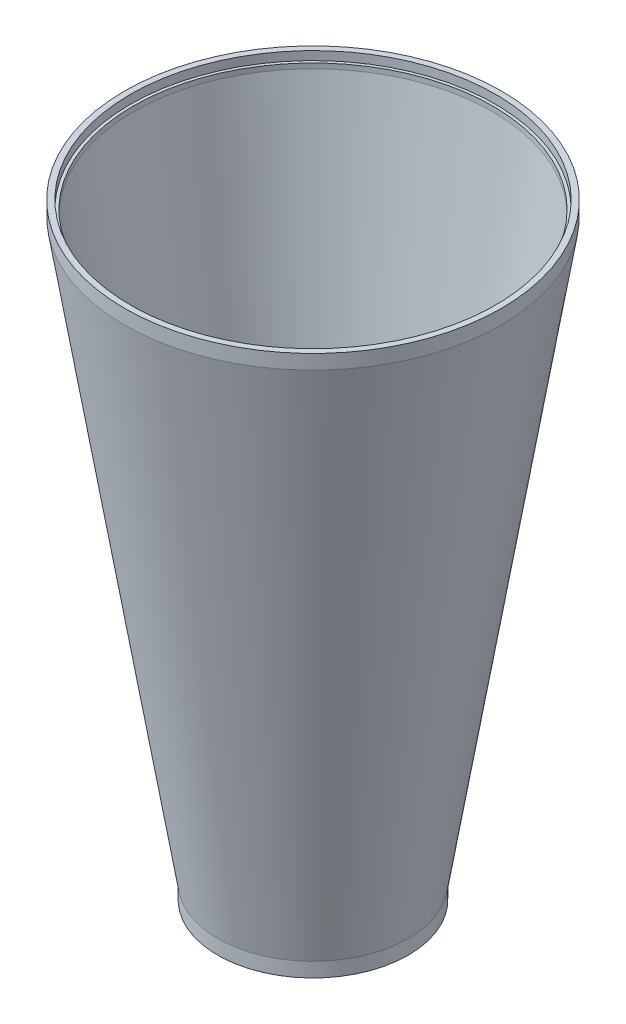
ISO-10303-21;
HEADER;
FILE_DESCRIPTION(('STEP AP214'),'2;1');
FILE_NAME('part.step','',(''),(''),'','','');
FILE_SCHEMA(('AUTOMOTIVE_DESIGN { 1 0 10303 214 1 1 1 1 }'));
ENDSEC;
DATA;
#1=APPLICATION_CONTEXT('core data for automotive mechanical design processes');
#2=APPLICATION_PROTOCOL_DEFINITION('international standard','automotive_design',2000,#1);
#3=PRODUCT_CONTEXT('',#1,'mechanical');
#4=PRODUCT('Part','Part','',(#3));
#5=PRODUCT_RELATED_PRODUCT_CATEGORY('part','',(#4));
#6=PRODUCT_DEFINITION_FORMATION('','',#4);
#7=PRODUCT_DEFINITION_CONTEXT('part definition',#1,'design');
#8=PRODUCT_DEFINITION('design','',#6,#7);
#9=PRODUCT_DEFINITION_SHAPE('','',#8);
#10=(LENGTH_UNIT() NAMED_UNIT(*) SI_UNIT(.MILLI.,.METRE.));
#11=(NAMED_UNIT(*) PLANE_ANGLE_UNIT() SI_UNIT($,.RADIAN.));
#12=(NAMED_UNIT(*) SI_UNIT($,.STERADIAN.) SOLID_ANGLE_UNIT());
#13=UNCERTAINTY_MEASURE_WITH_UNIT(LENGTH_MEASURE(1.E-05),#10,'distance_accuracy_value','');
#14=(GEOMETRIC_REPRESENTATION_CONTEXT(3) GLOBAL_UNCERTAINTY_ASSIGNED_CONTEXT((#13)) GLOBAL_UNIT_ASSIGNED_CONTEXT((#10,
#11,#12)) REPRESENTATION_CONTEXT('',''));
#15=CARTESIAN_POINT('',(0.,0.,0.));
#16=DIRECTION('',(0.,0.,1.));
#17=DIRECTION('',(1.,0.,0.));
#18=AXIS2_PLACEMENT_3D('',#15,#16,#17);
#19=CARTESIAN_POINT('',(0.,-205.,0.));
#20=DIRECTION('',(0.,-1.,0.));
#21=DIRECTION('',(1.,0.,0.));
#22=AXIS2_PLACEMENT_3D('',#19,#20,#21);
#23=CYLINDRICAL_SURFACE('',#22,30.);
#24=CARTESIAN_POINT('',(0.,-199.760045020194,0.));
#25=DIRECTION('',(0.,1.,0.));
#26=DIRECTION('',(-1.,0.,0.));
#27=AXIS2_PLACEMENT_3D('',#24,#25,#26);
#28=CIRCLE('',#27,30.);
#29=CARTESIAN_POINT('',(-30.,-199.760045020194,0.));
#30=VERTEX_POINT('',#29);
#31=EDGE_CURVE('E54',#30,#30,#28,.F.);
#32=ORIENTED_EDGE('',*,*,#31,.F.);
#33=EDGE_LOOP('',(#32));
#34=FACE_BOUND('',#33,.T.);
#35=CARTESIAN_POINT('',(0.,-202.,0.));
#36=DIRECTION('',(0.,-1.,0.));
#37=DIRECTION('',(0.,0.,-1.));
#38=AXIS2_PLACEMENT_3D('',#35,#36,#37);
#39=CIRCLE('',#38,30.);
#40=CARTESIAN_POINT('',(0.,-202.,-30.));
#41=VERTEX_POINT('',#40);
#42=EDGE_CURVE('E74',#41,#41,#39,.F.);
#43=ORIENTED_EDGE('',*,*,#42,.F.);
#44=EDGE_LOOP('',(#43));
#45=FACE_BOUND('',#44,.T.);
#46=ADVANCED_FACE('F35',(#34,#45),#23,.F.);
#47=CARTESIAN_POINT('',(0.,5.,0.));
#48=DIRECTION('',(0.,-1.,0.));
#49=DIRECTION('',(1.,0.,0.));
#50=AXIS2_PLACEMENT_3D('',#47,#48,#49);
#51=CYLINDRICAL_SURFACE('',#50,62.2);
#52=CARTESIAN_POINT('',(0.,0.239954979805668,0.));
#53=DIRECTION('',(0.,1.,0.));
#54=DIRECTION('',(-1.,0.,0.));
#55=AXIS2_PLACEMENT_3D('',#52,#53,#54);
#56=CIRCLE('',#55,62.2);
#57=CARTESIAN_POINT('',(-62.2,0.239954979805656,0.));
#58=VERTEX_POINT('',#57);
#59=EDGE_CURVE('E58',#58,#58,#56,.T.);
#60=ORIENTED_EDGE('',*,*,#59,.F.);
#61=EDGE_LOOP('',(#60));
#62=FACE_BOUND('',#61,.T.);
#63=CARTESIAN_POINT('',(0.,2.,0.));
#64=DIRECTION('',(0.,1.,0.));
#65=DIRECTION('',(-1.,0.,0.));
#66=AXIS2_PLACEMENT_3D('',#63,#64,#65);
#67=CIRCLE('',#66,62.2);
#68=CARTESIAN_POINT('',(-62.2,1.99999999999999,0.));
#69=VERTEX_POINT('',#68);
#70=EDGE_CURVE('E65',#69,#69,#67,.F.);
#71=ORIENTED_EDGE('',*,*,#70,.F.);
#72=EDGE_LOOP('',(#71));
#73=FACE_BOUND('',#72,.T.);
#74=ADVANCED_FACE('F84',(#62,#73),#51,.F.);
#75=CARTESIAN_POINT('',(0.,-200.,0.));
#76=DIRECTION('',(0.,1.,0.));
#77=DIRECTION('',(-1.,0.,0.));
#78=AXIS2_PLACEMENT_3D('',#75,#76,#77);
#79=CONICAL_SURFACE('',#78,33.,0.159630148790674);
#80=CARTESIAN_POINT('',(0.,0.,0.));
#81=DIRECTION('',(0.,1.,0.));
#82=DIRECTION('',(-1.,0.,0.));
#83=AXIS2_PLACEMENT_3D('',#80,#81,#82);
#84=CIRCLE('',#83,65.2);
#85=CARTESIAN_POINT('',(-65.2,0.,0.));
#86=VERTEX_POINT('',#85);
#87=EDGE_CURVE('E50',#86,#86,#84,.T.);
#88=ORIENTED_EDGE('',*,*,#87,.F.);
#89=EDGE_LOOP('',(#88));
#90=FACE_BOUND('',#89,.T.);
#91=CARTESIAN_POINT('',(0.,-200.,0.));
#92=DIRECTION('',(0.,-1.,0.));
#93=DIRECTION('',(1.,0.,0.));
#94=AXIS2_PLACEMENT_3D('',#91,#92,#93);
#95=CIRCLE('',#94,33.);
#96=CARTESIAN_POINT('',(33.,-200.,0.));
#97=VERTEX_POINT('',#96);
#98=EDGE_CURVE('E10',#97,#97,#95,.T.);
#99=ORIENTED_EDGE('',*,*,#98,.F.);
#100=EDGE_LOOP('',(#99));
#101=FACE_BOUND('',#100,.T.);
#102=ADVANCED_FACE('F37',(#90,#101),#79,.T.);
#103=CARTESIAN_POINT('',(0.,-205.,0.));
#104=DIRECTION('',(0.,-1.,0.));
#105=DIRECTION('',(1.,0.,0.));
#106=AXIS2_PLACEMENT_3D('',#103,#104,#105);
#107=CYLINDRICAL_SURFACE('',#106,33.);
#108=ORIENTED_EDGE('',*,*,#98,.T.);
#109=EDGE_LOOP('',(#108));
#110=FACE_BOUND('',#109,.T.);
#111=CARTESIAN_POINT('',(0.,-205.,0.));
#112=DIRECTION('',(0.,-1.,0.));
#113=DIRECTION('',(1.,0.,0.));
#114=AXIS2_PLACEMENT_3D('',#111,#112,#113);
#115=CIRCLE('',#114,33.);
#116=CARTESIAN_POINT('',(33.,-205.,0.));
#117=VERTEX_POINT('',#116);
#118=EDGE_CURVE('E42',#117,#117,#115,.T.);
#119=ORIENTED_EDGE('',*,*,#118,.F.);
#120=EDGE_LOOP('',(#119));
#121=FACE_BOUND('',#120,.T.);
#122=ADVANCED_FACE('F107',(#110,#121),#107,.T.);
#123=CARTESIAN_POINT('',(33.,-205.,0.));
#124=DIRECTION('',(0.,-1.,0.));
#125=DIRECTION('',(1.,0.,0.));
#126=AXIS2_PLACEMENT_3D('',#123,#124,#125);
#127=PLANE('',#126);
#128=CARTESIAN_POINT('',(0.,-205.,0.));
#129=DIRECTION('',(0.,-1.,0.));
#130=DIRECTION('',(0.,0.,-1.));
#131=AXIS2_PLACEMENT_3D('',#128,#129,#130);
#132=CIRCLE('',#131,31.);
#133=CARTESIAN_POINT('',(0.,-205.,-31.));
#134=VERTEX_POINT('',#133);
#135=EDGE_CURVE('E71',#134,#134,#132,.T.);
#136=ORIENTED_EDGE('',*,*,#135,.F.);
#137=EDGE_LOOP('',(#136));
#138=FACE_BOUND('',#137,.T.);
#139=ORIENTED_EDGE('',*,*,#118,.T.);
#140=EDGE_LOOP('',(#139));
#141=FACE_BOUND('',#140,.T.);
#142=ADVANCED_FACE('F104',(#138,#141),#127,.T.);
#143=CARTESIAN_POINT('',(0.,5.,0.));
#144=DIRECTION('',(0.,-1.,0.));
#145=DIRECTION('',(1.,0.,0.));
#146=AXIS2_PLACEMENT_3D('',#143,#144,#145);
#147=CYLINDRICAL_SURFACE('',#146,65.2);
#148=CARTESIAN_POINT('',(0.,5.,0.));
#149=DIRECTION('',(0.,1.,0.));
#150=DIRECTION('',(-1.,0.,0.));
#151=AXIS2_PLACEMENT_3D('',#148,#149,#150);
#152=CIRCLE('',#151,65.2);
#153=CARTESIAN_POINT('',(-65.2,4.99999999999999,0.));
#154=VERTEX_POINT('',#153);
#155=EDGE_CURVE('E46',#154,#154,#152,.T.);
#156=ORIENTED_EDGE('',*,*,#155,.F.);
#157=EDGE_LOOP('',(#156));
#158=FACE_BOUND('',#157,.T.);
#159=ORIENTED_EDGE('',*,*,#87,.T.);
#160=EDGE_LOOP('',(#159));
#161=FACE_BOUND('',#160,.T.);
#162=ADVANCED_FACE('F100',(#158,#161),#147,.T.);
#163=CARTESIAN_POINT('',(0.,5.,0.));
#164=DIRECTION('',(0.,1.,0.));
#165=DIRECTION('',(-1.,0.,0.));
#166=AXIS2_PLACEMENT_3D('',#163,#164,#165);
#167=PLANE('',#166);
#168=CARTESIAN_POINT('',(0.,5.,0.));
#169=DIRECTION('',(0.,1.,0.));
#170=DIRECTION('',(-1.,0.,0.));
#171=AXIS2_PLACEMENT_3D('',#168,#169,#170);
#172=CIRCLE('',#171,63.2);
#173=CARTESIAN_POINT('',(-63.2,4.99999999999999,0.));
#174=VERTEX_POINT('',#173);
#175=EDGE_CURVE('E62',#174,#174,#172,.T.);
#176=ORIENTED_EDGE('',*,*,#175,.F.);
#177=EDGE_LOOP('',(#176));
#178=FACE_BOUND('',#177,.T.);
#179=ORIENTED_EDGE('',*,*,#155,.T.);
#180=EDGE_LOOP('',(#179));
#181=FACE_BOUND('',#180,.T.);
#182=ADVANCED_FACE('F97',(#178,#181),#167,.T.);
#183=CARTESIAN_POINT('',(0.,-199.523140794436,0.));
#184=DIRECTION('',(0.,1.,0.));
#185=DIRECTION('',(-1.,0.,0.));
#186=AXIS2_PLACEMENT_3D('',#183,#184,#185);
#187=CONICAL_SURFACE('',#186,30.0381415803471,0.159630148790674);
#188=ORIENTED_EDGE('',*,*,#59,.T.);
#189=EDGE_LOOP('',(#188));
#190=FACE_BOUND('',#189,.T.);
#191=ORIENTED_EDGE('',*,*,#31,.T.);
#192=EDGE_LOOP('',(#191));
#193=FACE_BOUND('',#192,.T.);
#194=ADVANCED_FACE('F94',(#190,#193),#187,.F.);
#195=CARTESIAN_POINT('',(0.,2.,0.));
#196=DIRECTION('',(0.,1.,0.));
#197=DIRECTION('',(-1.,0.,0.));
#198=AXIS2_PLACEMENT_3D('',#195,#196,#197);
#199=CYLINDRICAL_SURFACE('',#198,63.2);
#200=CARTESIAN_POINT('',(0.,2.,0.));
#201=DIRECTION('',(0.,1.,0.));
#202=DIRECTION('',(-1.,0.,0.));
#203=AXIS2_PLACEMENT_3D('',#200,#201,#202);
#204=CIRCLE('',#203,63.2);
#205=CARTESIAN_POINT('',(-63.2,1.99999999999999,0.));
#206=VERTEX_POINT('',#205);
#207=EDGE_CURVE('E61',#206,#206,#204,.T.);
#208=ORIENTED_EDGE('',*,*,#207,.F.);
#209=EDGE_LOOP('',(#208));
#210=FACE_BOUND('',#209,.T.);
#211=ORIENTED_EDGE('',*,*,#175,.T.);
#212=EDGE_LOOP('',(#211));
#213=FACE_BOUND('',#212,.T.);
#214=ADVANCED_FACE('F142',(#210,#213),#199,.F.);
#215=CARTESIAN_POINT('',(0.,2.,0.));
#216=DIRECTION('',(0.,1.,0.));
#217=DIRECTION('',(-1.,0.,0.));
#218=AXIS2_PLACEMENT_3D('',#215,#216,#217);
#219=PLANE('',#218);
#220=ORIENTED_EDGE('',*,*,#70,.T.);
#221=EDGE_LOOP('',(#220));
#222=FACE_BOUND('',#221,.T.);
#223=ORIENTED_EDGE('',*,*,#207,.T.);
#224=EDGE_LOOP('',(#223));
#225=FACE_BOUND('',#224,.T.);
#226=ADVANCED_FACE('F146',(#222,#225),#219,.T.);
#227=CARTESIAN_POINT('',(0.,-202.,0.));
#228=DIRECTION('',(0.,-1.,0.));
#229=DIRECTION('',(1.,0.,0.));
#230=AXIS2_PLACEMENT_3D('',#227,#228,#229);
#231=CYLINDRICAL_SURFACE('',#230,31.);
#232=CARTESIAN_POINT('',(0.,-202.,0.));
#233=DIRECTION('',(0.,-1.,0.));
#234=DIRECTION('',(0.,0.,-1.));
#235=AXIS2_PLACEMENT_3D('',#232,#233,#234);
#236=CIRCLE('',#235,31.);
#237=CARTESIAN_POINT('',(0.,-202.,-31.));
#238=VERTEX_POINT('',#237);
#239=EDGE_CURVE('E66',#238,#238,#236,.T.);
#240=ORIENTED_EDGE('',*,*,#239,.F.);
#241=EDGE_LOOP('',(#240));
#242=FACE_BOUND('',#241,.T.);
#243=ORIENTED_EDGE('',*,*,#135,.T.);
#244=EDGE_LOOP('',(#243));
#245=FACE_BOUND('',#244,.T.);
#246=ADVANCED_FACE('F154',(#242,#245),#231,.F.);
#247=CARTESIAN_POINT('',(0.,-202.,0.));
#248=DIRECTION('',(0.,-1.,0.));
#249=DIRECTION('',(0.,0.,-1.));
#250=AXIS2_PLACEMENT_3D('',#247,#248,#249);
#251=PLANE('',#250);
#252=ORIENTED_EDGE('',*,*,#42,.T.);
#253=EDGE_LOOP('',(#252));
#254=FACE_BOUND('',#253,.T.);
#255=ORIENTED_EDGE('',*,*,#239,.T.);
#256=EDGE_LOOP('',(#255));
#257=FACE_BOUND('',#256,.T.);
#258=ADVANCED_FACE('F80',(#254,#257),#251,.T.);
#259=CLOSED_SHELL('',(#46,#74,#102,#122,#142,#162,#182,#194,#214,#226,#246,#258));
#260=MANIFOLD_SOLID_BREP('B2',#259);
#261=ADVANCED_BREP_SHAPE_REPRESENTATION('',(#18,#260),#14);
#262=SHAPE_DEFINITION_REPRESENTATION(#9,#261);
ENDSEC;
END-ISO-10303-21;
